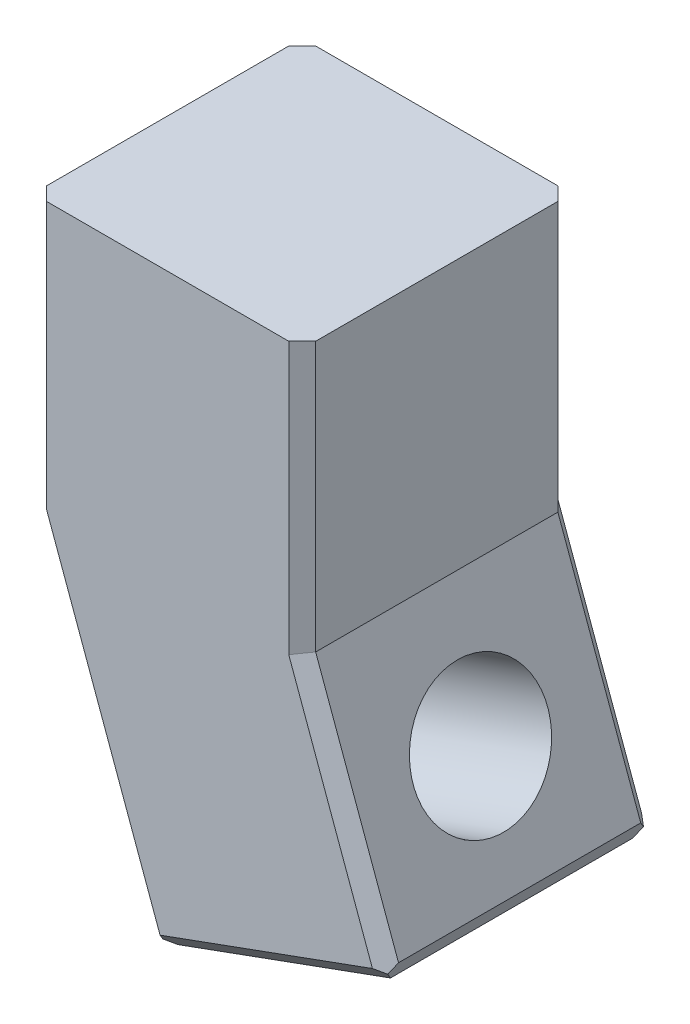
ISO-10303-21;
HEADER;
FILE_DESCRIPTION(('STEP AP214'),'2;1');
FILE_NAME('part.step','',(''),(''),'','','');
FILE_SCHEMA(('AUTOMOTIVE_DESIGN { 1 0 10303 214 1 1 1 1 }'));
ENDSEC;
DATA;
#1=APPLICATION_CONTEXT('core data for automotive mechanical design processes');
#2=APPLICATION_PROTOCOL_DEFINITION('international standard','automotive_design',2000,#1);
#3=PRODUCT_CONTEXT('',#1,'mechanical');
#4=PRODUCT('Part','Part','',(#3));
#5=PRODUCT_RELATED_PRODUCT_CATEGORY('part','',(#4));
#6=PRODUCT_DEFINITION_FORMATION('','',#4);
#7=PRODUCT_DEFINITION_CONTEXT('part definition',#1,'design');
#8=PRODUCT_DEFINITION('design','',#6,#7);
#9=PRODUCT_DEFINITION_SHAPE('','',#8);
#10=(LENGTH_UNIT() NAMED_UNIT(*) SI_UNIT(.MILLI.,.METRE.));
#11=(NAMED_UNIT(*) PLANE_ANGLE_UNIT() SI_UNIT($,.RADIAN.));
#12=(NAMED_UNIT(*) SI_UNIT($,.STERADIAN.) SOLID_ANGLE_UNIT());
#13=UNCERTAINTY_MEASURE_WITH_UNIT(LENGTH_MEASURE(1.E-05),#10,'distance_accuracy_value','');
#14=(GEOMETRIC_REPRESENTATION_CONTEXT(3) GLOBAL_UNCERTAINTY_ASSIGNED_CONTEXT((#13)) GLOBAL_UNIT_ASSIGNED_CONTEXT((#10,
#11,#12)) REPRESENTATION_CONTEXT('',''));
#15=CARTESIAN_POINT('',(0.,0.,0.));
#16=DIRECTION('',(0.,0.,1.));
#17=DIRECTION('',(1.,0.,0.));
#18=AXIS2_PLACEMENT_3D('',#15,#16,#17);
#19=CARTESIAN_POINT('',(10.,-10.,20.));
#20=DIRECTION('',(-1.,0.,0.));
#21=DIRECTION('',(0.,0.,1.));
#22=AXIS2_PLACEMENT_3D('',#19,#20,#21);
#23=PLANE('',#22);
#24=DIRECTION('',(0.,0.,-1.));
#25=VECTOR('',#24,1.);
#26=CARTESIAN_POINT('',(10.,-10.,20.));
#27=LINE('',#26,#25);
#28=CARTESIAN_POINT('',(10.,-10.,19.));
#29=VERTEX_POINT('',#28);
#30=CARTESIAN_POINT('',(10.,-10.,1.));
#31=VERTEX_POINT('',#30);
#32=EDGE_CURVE('E337',#29,#31,#27,.T.);
#33=ORIENTED_EDGE('',*,*,#32,.T.);
#34=DIRECTION('',(0.,1.,0.));
#35=VECTOR('',#34,1.);
#36=CARTESIAN_POINT('',(10.,10.,1.));
#37=LINE('',#36,#35);
#38=CARTESIAN_POINT('',(10.,10.,1.));
#39=VERTEX_POINT('',#38);
#40=EDGE_CURVE('E284',#31,#39,#37,.T.);
#41=ORIENTED_EDGE('',*,*,#40,.T.);
#42=DIRECTION('',(0.,0.,-1.));
#43=VECTOR('',#42,1.);
#44=CARTESIAN_POINT('',(10.,10.,20.));
#45=LINE('',#44,#43);
#46=CARTESIAN_POINT('',(10.,10.,19.));
#47=VERTEX_POINT('',#46);
#48=EDGE_CURVE('E183',#47,#39,#45,.T.);
#49=ORIENTED_EDGE('',*,*,#48,.F.);
#50=DIRECTION('',(0.,-1.,0.));
#51=VECTOR('',#50,1.);
#52=CARTESIAN_POINT('',(10.,-10.,19.));
#53=LINE('',#52,#51);
#54=EDGE_CURVE('E281',#47,#29,#53,.T.);
#55=ORIENTED_EDGE('',*,*,#54,.T.);
#56=EDGE_LOOP('',(#33,#41,#49,#55));
#57=FACE_BOUND('',#56,.T.);
#58=ADVANCED_FACE('F40',(#57),#23,.F.);
#59=CARTESIAN_POINT('',(-10.,10.,20.));
#60=DIRECTION('',(0.,-1.,0.));
#61=DIRECTION('',(0.,0.,-1.));
#62=AXIS2_PLACEMENT_3D('',#59,#60,#61);
#63=PLANE('',#62);
#64=DIRECTION('',(-1.,0.,0.));
#65=VECTOR('',#64,1.);
#66=CARTESIAN_POINT('',(-10.,10.,0.));
#67=LINE('',#66,#65);
#68=CARTESIAN_POINT('',(8.99999999999999,10.,0.));
#69=VERTEX_POINT('',#68);
#70=CARTESIAN_POINT('',(-9.,10.,0.));
#71=VERTEX_POINT('',#70);
#72=EDGE_CURVE('E357',#69,#71,#67,.T.);
#73=ORIENTED_EDGE('',*,*,#72,.T.);
#74=DIRECTION('',(-0.70710678118655,0.,0.707106781186545));
#75=VECTOR('',#74,1.);
#76=CARTESIAN_POINT('',(-10.,10.,1.));
#77=LINE('',#76,#75);
#78=CARTESIAN_POINT('',(-10.,10.,1.));
#79=VERTEX_POINT('',#78);
#80=EDGE_CURVE('E265',#71,#79,#77,.T.);
#81=ORIENTED_EDGE('',*,*,#80,.T.);
#82=DIRECTION('',(0.,0.,-1.));
#83=VECTOR('',#82,1.);
#84=CARTESIAN_POINT('',(-10.,10.,20.));
#85=LINE('',#84,#83);
#86=CARTESIAN_POINT('',(-10.,10.,19.));
#87=VERTEX_POINT('',#86);
#88=EDGE_CURVE('E322',#87,#79,#85,.T.);
#89=ORIENTED_EDGE('',*,*,#88,.F.);
#90=DIRECTION('',(-0.707106781186548,0.,-0.707106781186548));
#91=VECTOR('',#90,1.);
#92=CARTESIAN_POINT('',(-9.00000000000001,10.,20.));
#93=LINE('',#92,#91);
#94=CARTESIAN_POINT('',(-9.00000000000001,10.,20.));
#95=VERTEX_POINT('',#94);
#96=EDGE_CURVE('E256',#87,#95,#93,.F.);
#97=ORIENTED_EDGE('',*,*,#96,.T.);
#98=DIRECTION('',(-1.,0.,0.));
#99=VECTOR('',#98,1.);
#100=CARTESIAN_POINT('',(-10.,10.,20.));
#101=LINE('',#100,#99);
#102=CARTESIAN_POINT('',(9.,10.,20.));
#103=VERTEX_POINT('',#102);
#104=EDGE_CURVE('E352',#103,#95,#101,.T.);
#105=ORIENTED_EDGE('',*,*,#104,.F.);
#106=DIRECTION('',(-0.707106781186548,0.,0.707106781186548));
#107=VECTOR('',#106,1.);
#108=CARTESIAN_POINT('',(9.,10.,20.));
#109=LINE('',#108,#107);
#110=EDGE_CURVE('E259',#103,#47,#109,.F.);
#111=ORIENTED_EDGE('',*,*,#110,.T.);
#112=ORIENTED_EDGE('',*,*,#48,.T.);
#113=DIRECTION('',(-0.70710678118655,0.,-0.707106781186545));
#114=VECTOR('',#113,1.);
#115=CARTESIAN_POINT('',(10.,10.,1.));
#116=LINE('',#115,#114);
#117=EDGE_CURVE('E262',#39,#69,#116,.T.);
#118=ORIENTED_EDGE('',*,*,#117,.T.);
#119=EDGE_LOOP('',(#73,#81,#89,#97,#105,#111,#112,#118));
#120=FACE_BOUND('',#119,.T.);
#121=ADVANCED_FACE('F328',(#120),#63,.F.);
#122=CARTESIAN_POINT('',(-10.,-10.,20.));
#123=DIRECTION('',(1.,0.,0.));
#124=DIRECTION('',(0.,0.,-1.));
#125=AXIS2_PLACEMENT_3D('',#122,#123,#124);
#126=PLANE('',#125);
#127=ORIENTED_EDGE('',*,*,#88,.T.);
#128=DIRECTION('',(0.,-1.,0.));
#129=VECTOR('',#128,1.);
#130=CARTESIAN_POINT('',(-10.,-10.,1.));
#131=LINE('',#130,#129);
#132=CARTESIAN_POINT('',(-10.,-10.,1.));
#133=VERTEX_POINT('',#132);
#134=EDGE_CURVE('E253',#79,#133,#131,.T.);
#135=ORIENTED_EDGE('',*,*,#134,.T.);
#136=DIRECTION('',(0.,0.,-1.));
#137=VECTOR('',#136,1.);
#138=CARTESIAN_POINT('',(-10.,-10.,20.));
#139=LINE('',#138,#137);
#140=CARTESIAN_POINT('',(-10.,-10.,19.));
#141=VERTEX_POINT('',#140);
#142=EDGE_CURVE('E325',#141,#133,#139,.T.);
#143=ORIENTED_EDGE('',*,*,#142,.F.);
#144=DIRECTION('',(0.,1.,0.));
#145=VECTOR('',#144,1.);
#146=CARTESIAN_POINT('',(-10.,-10.,19.));
#147=LINE('',#146,#145);
#148=EDGE_CURVE('E250',#141,#87,#147,.T.);
#149=ORIENTED_EDGE('',*,*,#148,.T.);
#150=EDGE_LOOP('',(#127,#135,#143,#149));
#151=FACE_BOUND('',#150,.T.);
#152=ADVANCED_FACE('F321',(#151),#126,.F.);
#153=CARTESIAN_POINT('',(-10.,-10.,20.));
#154=DIRECTION('',(0.93969262078591,0.342020143325663,0.));
#155=DIRECTION('',(-0.342020143325663,0.939692620785911,0.));
#156=AXIS2_PLACEMENT_3D('',#153,#154,#155);
#157=PLANE('',#156);
#158=CARTESIAN_POINT('',(-4.41017693914646,-25.3579126384421,10.));
#159=DIRECTION('',(0.93969262078591,0.342020143325663,0.));
#160=DIRECTION('',(-0.342020143325663,0.939692620785911,0.));
#161=AXIS2_PLACEMENT_3D('',#158,#159,#160);
#162=CIRCLE('',#161,5.);
#163=CARTESIAN_POINT('',(-6.12027765577478,-20.6594495345126,10.));
#164=VERTEX_POINT('',#163);
#165=EDGE_CURVE('E370',#164,#164,#162,.T.);
#166=ORIENTED_EDGE('',*,*,#165,.T.);
#167=EDGE_LOOP('',(#166));
#168=FACE_BOUND('',#167,.T.);
#169=ORIENTED_EDGE('',*,*,#142,.T.);
#170=DIRECTION('',(0.342020143325663,-0.939692620785911,0.));
#171=VECTOR('',#170,1.);
#172=CARTESIAN_POINT('',(-1.50192959042872,-33.348256559233,1.));
#173=LINE('',#172,#171);
#174=CARTESIAN_POINT('',(-1.50192959042872,-33.348256559233,1.));
#175=VERTEX_POINT('',#174);
#176=EDGE_CURVE('E223',#133,#175,#173,.T.);
#177=ORIENTED_EDGE('',*,*,#176,.T.);
#178=DIRECTION('',(0.,0.,1.));
#179=VECTOR('',#178,1.);
#180=CARTESIAN_POINT('',(-1.50192959042872,-33.348256559233,20.));
#181=LINE('',#180,#179);
#182=CARTESIAN_POINT('',(-1.50192959042872,-33.348256559233,19.));
#183=VERTEX_POINT('',#182);
#184=EDGE_CURVE('E190',#175,#183,#181,.T.);
#185=ORIENTED_EDGE('',*,*,#184,.T.);
#186=DIRECTION('',(-0.342020143325663,0.939692620785911,0.));
#187=VECTOR('',#186,1.);
#188=CARTESIAN_POINT('',(-10.,-10.,19.));
#189=LINE('',#188,#187);
#190=EDGE_CURVE('E210',#183,#141,#189,.T.);
#191=ORIENTED_EDGE('',*,*,#190,.T.);
#192=EDGE_LOOP('',(#169,#177,#185,#191));
#193=FACE_BOUND('',#192,.T.);
#194=ADVANCED_FACE('F391',(#168,#193),#157,.F.);
#195=CARTESIAN_POINT('',(16.5005349840868,-27.8600730831536,20.));
#196=DIRECTION('',(-0.342020143325663,0.93969262078591,0.));
#197=DIRECTION('',(-0.93969262078591,-0.342020143325663,0.));
#198=AXIS2_PLACEMENT_3D('',#195,#196,#197);
#199=PLANE('',#198);
#200=DIRECTION('',(-0.93969262078591,-0.342020143325663,0.));
#201=VECTOR('',#200,1.);
#202=CARTESIAN_POINT('',(16.5005349840868,-27.8600730831536,19.));
#203=LINE('',#202,#201);
#204=CARTESIAN_POINT('',(15.5608423633009,-28.2020932264793,19.));
#205=VERTEX_POINT('',#204);
#206=CARTESIAN_POINT('',(-0.220216826317152,-33.9459290366933,19.));
#207=VERTEX_POINT('',#206);
#208=EDGE_CURVE('E187',#205,#207,#203,.T.);
#209=ORIENTED_EDGE('',*,*,#208,.T.);
#210=DIRECTION('',(0.,0.,-1.));
#211=VECTOR('',#210,1.);
#212=CARTESIAN_POINT('',(-0.220216826317156,-33.9459290366933,20.));
#213=LINE('',#212,#211);
#214=CARTESIAN_POINT('',(-0.220216826317152,-33.9459290366933,1.));
#215=VERTEX_POINT('',#214);
#216=EDGE_CURVE('E166',#207,#215,#213,.T.);
#217=ORIENTED_EDGE('',*,*,#216,.T.);
#218=DIRECTION('',(0.93969262078591,0.342020143325663,0.));
#219=VECTOR('',#218,1.);
#220=CARTESIAN_POINT('',(16.5005349840868,-27.8600730831536,1.));
#221=LINE('',#220,#219);
#222=CARTESIAN_POINT('',(15.5608423633009,-28.2020932264793,1.));
#223=VERTEX_POINT('',#222);
#224=EDGE_CURVE('E175',#215,#223,#221,.T.);
#225=ORIENTED_EDGE('',*,*,#224,.T.);
#226=DIRECTION('',(0.,0.,1.));
#227=VECTOR('',#226,1.);
#228=CARTESIAN_POINT('',(15.5608423633009,-28.2020932264793,20.));
#229=LINE('',#228,#227);
#230=EDGE_CURVE('E182',#223,#205,#229,.T.);
#231=ORIENTED_EDGE('',*,*,#230,.T.);
#232=EDGE_LOOP('',(#209,#217,#225,#231));
#233=FACE_BOUND('',#232,.T.);
#234=ADVANCED_FACE('F185',(#233),#199,.F.);
#235=CARTESIAN_POINT('',(10.,-10.,20.));
#236=DIRECTION('',(-0.93969262078591,-0.342020143325663,0.));
#237=DIRECTION('',(0.342020143325663,-0.93969262078591,0.));
#238=AXIS2_PLACEMENT_3D('',#235,#236,#237);
#239=PLANE('',#238);
#240=CARTESIAN_POINT('',(13.2502674920434,-18.9300365415768,10.));
#241=DIRECTION('',(0.93969262078591,0.342020143325663,0.));
#242=DIRECTION('',(-0.342020143325663,0.93969262078591,0.));
#243=AXIS2_PLACEMENT_3D('',#240,#241,#242);
#244=CIRCLE('',#243,5.);
#245=CARTESIAN_POINT('',(11.5401667754151,-14.2315734376473,10.));
#246=VERTEX_POINT('',#245);
#247=EDGE_CURVE('E220',#246,#246,#244,.T.);
#248=ORIENTED_EDGE('',*,*,#247,.F.);
#249=EDGE_LOOP('',(#248));
#250=FACE_BOUND('',#249,.T.);
#251=DIRECTION('',(0.,0.,-1.));
#252=VECTOR('',#251,1.);
#253=CARTESIAN_POINT('',(16.1585148407611,-26.9203804623677,20.));
#254=LINE('',#253,#252);
#255=CARTESIAN_POINT('',(16.1585148407611,-26.9203804623677,19.));
#256=VERTEX_POINT('',#255);
#257=CARTESIAN_POINT('',(16.1585148407611,-26.9203804623677,1.));
#258=VERTEX_POINT('',#257);
#259=EDGE_CURVE('E203',#256,#258,#254,.T.);
#260=ORIENTED_EDGE('',*,*,#259,.T.);
#261=DIRECTION('',(-0.342020143325663,0.93969262078591,0.));
#262=VECTOR('',#261,1.);
#263=CARTESIAN_POINT('',(10.,-10.,1.));
#264=LINE('',#263,#262);
#265=EDGE_CURVE('E271',#258,#31,#264,.T.);
#266=ORIENTED_EDGE('',*,*,#265,.T.);
#267=ORIENTED_EDGE('',*,*,#32,.F.);
#268=DIRECTION('',(0.342020143325663,-0.93969262078591,0.));
#269=VECTOR('',#268,1.);
#270=CARTESIAN_POINT('',(10.,-10.,19.));
#271=LINE('',#270,#269);
#272=EDGE_CURVE('E268',#29,#256,#271,.T.);
#273=ORIENTED_EDGE('',*,*,#272,.T.);
#274=EDGE_LOOP('',(#260,#266,#267,#273));
#275=FACE_BOUND('',#274,.T.);
#276=ADVANCED_FACE('F365',(#250,#275),#239,.F.);
#277=CARTESIAN_POINT('',(0.,0.,20.));
#278=DIRECTION('',(0.,0.,-1.));
#279=DIRECTION('',(-1.,0.,0.));
#280=AXIS2_PLACEMENT_3D('',#277,#278,#279);
#281=PLANE('',#280);
#282=DIRECTION('',(0.93969262078591,0.342020143325664,0.));
#283=VECTOR('',#282,1.);
#284=CARTESIAN_POINT('',(10.5422306735989,-28.9645407263953,20.));
#285=LINE('',#284,#283);
#286=CARTESIAN_POINT('',(-0.562236969642822,-33.0062364159074,20.));
#287=VERTEX_POINT('',#286);
#288=CARTESIAN_POINT('',(15.2188222199752,-27.2624006056934,20.));
#289=VERTEX_POINT('',#288);
#290=EDGE_CURVE('E195',#287,#289,#285,.T.);
#291=ORIENTED_EDGE('',*,*,#290,.T.);
#292=DIRECTION('',(-0.342020143325663,0.93969262078591,0.));
#293=VECTOR('',#292,1.);
#294=CARTESIAN_POINT('',(4.67659154637637,1.70214012070192,20.));
#295=LINE('',#294,#293);
#296=CARTESIAN_POINT('',(9.,-10.1763269807085,20.));
#297=VERTEX_POINT('',#296);
#298=EDGE_CURVE('E295',#289,#297,#295,.T.);
#299=ORIENTED_EDGE('',*,*,#298,.T.);
#300=DIRECTION('',(0.,1.,0.));
#301=VECTOR('',#300,1.);
#302=CARTESIAN_POINT('',(9.,0.,20.));
#303=LINE('',#302,#301);
#304=EDGE_CURVE('E292',#297,#103,#303,.T.);
#305=ORIENTED_EDGE('',*,*,#304,.T.);
#306=ORIENTED_EDGE('',*,*,#104,.T.);
#307=DIRECTION('',(0.,-1.,0.));
#308=VECTOR('',#307,1.);
#309=CARTESIAN_POINT('',(-9.00000000000001,0.,20.));
#310=LINE('',#309,#308);
#311=CARTESIAN_POINT('',(-9.00000000000001,-9.82367301929153,20.));
#312=VERTEX_POINT('',#311);
#313=EDGE_CURVE('E67',#95,#312,#310,.T.);
#314=ORIENTED_EDGE('',*,*,#313,.T.);
#315=DIRECTION('',(0.342020143325663,-0.939692620785911,0.));
#316=VECTOR('',#315,1.);
#317=CARTESIAN_POINT('',(-11.1044676432417,-4.04169568951206,20.));
#318=LINE('',#317,#316);
#319=EDGE_CURVE('E289',#312,#287,#318,.T.);
#320=ORIENTED_EDGE('',*,*,#319,.T.);
#321=EDGE_LOOP('',(#291,#299,#305,#306,#314,#320));
#322=FACE_BOUND('',#321,.T.);
#323=ADVANCED_FACE('F350',(#322),#281,.F.);
#324=CARTESIAN_POINT('',(0.,0.,0.));
#325=DIRECTION('',(0.,0.,-1.));
#326=DIRECTION('',(-1.,0.,0.));
#327=AXIS2_PLACEMENT_3D('',#324,#325,#326);
#328=PLANE('',#327);
#329=DIRECTION('',(-0.93969262078591,-0.342020143325664,0.));
#330=VECTOR('',#329,1.);
#331=CARTESIAN_POINT('',(-1.50192959042872,-33.348256559233,0.));
#332=LINE('',#331,#330);
#333=CARTESIAN_POINT('',(15.2188222199752,-27.2624006056934,0.));
#334=VERTEX_POINT('',#333);
#335=CARTESIAN_POINT('',(-0.562236969642803,-33.0062364159074,0.));
#336=VERTEX_POINT('',#335);
#337=EDGE_CURVE('E207',#334,#336,#332,.T.);
#338=ORIENTED_EDGE('',*,*,#337,.T.);
#339=DIRECTION('',(-0.342020143325663,0.939692620785911,0.));
#340=VECTOR('',#339,1.);
#341=CARTESIAN_POINT('',(-9.06030737921408,-9.65797985667433,0.));
#342=LINE('',#341,#340);
#343=CARTESIAN_POINT('',(-9.,-9.82367301929153,0.));
#344=VERTEX_POINT('',#343);
#345=EDGE_CURVE('E247',#336,#344,#342,.T.);
#346=ORIENTED_EDGE('',*,*,#345,.T.);
#347=DIRECTION('',(0.,1.,0.));
#348=VECTOR('',#347,1.);
#349=CARTESIAN_POINT('',(-9.,10.,0.));
#350=LINE('',#349,#348);
#351=EDGE_CURVE('E244',#344,#71,#350,.T.);
#352=ORIENTED_EDGE('',*,*,#351,.T.);
#353=ORIENTED_EDGE('',*,*,#72,.F.);
#354=DIRECTION('',(0.,-1.,0.));
#355=VECTOR('',#354,1.);
#356=CARTESIAN_POINT('',(8.99999999999999,-10.,0.));
#357=LINE('',#356,#355);
#358=CARTESIAN_POINT('',(8.99999999999999,-10.1763269807085,0.));
#359=VERTEX_POINT('',#358);
#360=EDGE_CURVE('E238',#69,#359,#357,.T.);
#361=ORIENTED_EDGE('',*,*,#360,.T.);
#362=DIRECTION('',(0.342020143325663,-0.93969262078591,0.));
#363=VECTOR('',#362,1.);
#364=CARTESIAN_POINT('',(15.2188222199752,-27.2624006056934,0.));
#365=LINE('',#364,#363);
#366=EDGE_CURVE('E241',#359,#334,#365,.T.);
#367=ORIENTED_EDGE('',*,*,#366,.T.);
#368=EDGE_LOOP('',(#338,#346,#352,#353,#361,#367));
#369=FACE_BOUND('',#368,.T.);
#370=ADVANCED_FACE('F388',(#369),#328,.T.);
#371=CARTESIAN_POINT('',(-5.54358492367481,-25.7704394080901,10.));
#372=DIRECTION('',(0.93969262078591,0.342020143325663,0.));
#373=DIRECTION('',(-0.342020143325663,0.93969262078591,0.));
#374=AXIS2_PLACEMENT_3D('',#371,#372,#373);
#375=CYLINDRICAL_SURFACE('',#374,5.);
#376=ORIENTED_EDGE('',*,*,#247,.T.);
#377=EDGE_LOOP('',(#376));
#378=FACE_BOUND('',#377,.T.);
#379=ORIENTED_EDGE('',*,*,#165,.F.);
#380=EDGE_LOOP('',(#379));
#381=FACE_BOUND('',#380,.T.);
#382=ADVANCED_FACE('F379',(#378,#381),#375,.F.);
#383=CARTESIAN_POINT('',(16.1585148407611,-26.9203804623677,20.));
#384=DIRECTION('',(-0.906307787036649,0.422618261740701,0.));
#385=DIRECTION('',(0.,0.,-1.));
#386=AXIS2_PLACEMENT_3D('',#383,#384,#385);
#387=PLANE('',#386);
#388=DIRECTION('',(0.345066365748901,0.739997209383598,-0.577350269189626));
#389=VECTOR('',#388,1.);
#390=CARTESIAN_POINT('',(15.7600665224543,-27.7748556384421,0.666666666666669));
#391=LINE('',#390,#389);
#392=CARTESIAN_POINT('',(15.859678602031,-27.5612368444235,0.5));
#393=VERTEX_POINT('',#392);
#394=EDGE_CURVE('E178',#393,#223,#391,.F.);
#395=ORIENTED_EDGE('',*,*,#394,.F.);
#396=DIRECTION('',(-0.345066365748902,-0.739997209383601,-0.577350269189622));
#397=VECTOR('',#396,1.);
#398=CARTESIAN_POINT('',(19.943773864676,-18.8028662896611,7.33333333333324));
#399=LINE('',#398,#397);
#400=EDGE_CURVE('E278',#393,#258,#399,.F.);
#401=ORIENTED_EDGE('',*,*,#400,.T.);
#402=ORIENTED_EDGE('',*,*,#259,.F.);
#403=DIRECTION('',(-0.345066365748901,-0.739997209383598,0.577350269189625));
#404=VECTOR('',#403,1.);
#405=CARTESIAN_POINT('',(15.9592906816077,-27.3476180504049,19.3333333333333));
#406=LINE('',#405,#404);
#407=CARTESIAN_POINT('',(15.859678602031,-27.5612368444235,19.5));
#408=VERTEX_POINT('',#407);
#409=EDGE_CURVE('E275',#256,#408,#406,.T.);
#410=ORIENTED_EDGE('',*,*,#409,.T.);
#411=DIRECTION('',(-0.345066365748901,-0.739997209383598,-0.577350269189626));
#412=VECTOR('',#411,1.);
#413=CARTESIAN_POINT('',(16.1585148407611,-26.9203804623677,20.));
#414=LINE('',#413,#412);
#415=EDGE_CURVE('E216',#205,#408,#414,.F.);
#416=ORIENTED_EDGE('',*,*,#415,.F.);
#417=ORIENTED_EDGE('',*,*,#230,.F.);
#418=EDGE_LOOP('',(#395,#401,#402,#410,#416,#417));
#419=FACE_BOUND('',#418,.T.);
#420=ADVANCED_FACE('F343',(#419),#387,.F.);
#421=CARTESIAN_POINT('',(10.5422306735989,-28.9645407263953,20.));
#422=DIRECTION('',(-0.241844762647971,0.664463024388675,-0.707106781186549));
#423=DIRECTION('',(0.93969262078591,0.342020143325663,0.));
#424=AXIS2_PLACEMENT_3D('',#421,#422,#423);
#425=PLANE('',#424);
#426=ORIENTED_EDGE('',*,*,#415,.T.);
#427=DIRECTION('',(-0.739997209383596,0.345066365748906,0.577350269189626));
#428=VECTOR('',#427,1.);
#429=CARTESIAN_POINT('',(13.0925783309491,-26.2709167971352,21.6589082582008));
#430=LINE('',#429,#428);
#431=EDGE_CURVE('E11',#408,#289,#430,.T.);
#432=ORIENTED_EDGE('',*,*,#431,.T.);
#433=ORIENTED_EDGE('',*,*,#290,.F.);
#434=DIRECTION('',(-0.345066365748904,-0.739997209383597,-0.577350269189625));
#435=VECTOR('',#434,1.);
#436=CARTESIAN_POINT('',(1.79202034826706,-27.9575153049894,23.9390425470386));
#437=LINE('',#436,#435);
#438=CARTESIAN_POINT('',(-0.861073208372939,-33.6470927979631,19.5));
#439=VERTEX_POINT('',#438);
#440=EDGE_CURVE('E51',#287,#439,#437,.T.);
#441=ORIENTED_EDGE('',*,*,#440,.T.);
#442=DIRECTION('',(0.739997209383595,-0.345066365748906,-0.577350269189626));
#443=VECTOR('',#442,1.);
#444=CARTESIAN_POINT('',(3.97402910852636,-35.9017380362963,15.7276241196281));
#445=LINE('',#444,#443);
#446=EDGE_CURVE('E171',#207,#439,#445,.F.);
#447=ORIENTED_EDGE('',*,*,#446,.F.);
#448=ORIENTED_EDGE('',*,*,#208,.F.);
#449=EDGE_LOOP('',(#426,#432,#433,#441,#447,#448));
#450=FACE_BOUND('',#449,.T.);
#451=ADVANCED_FACE('F348',(#450),#425,.F.);
#452=CARTESIAN_POINT('',(16.5005349840868,-27.8600730831536,1.));
#453=DIRECTION('',(0.241844762647971,-0.664463024388675,-0.707106781186549));
#454=DIRECTION('',(-0.93969262078591,-0.342020143325663,0.));
#455=AXIS2_PLACEMENT_3D('',#452,#453,#454);
#456=PLANE('',#455);
#457=DIRECTION('',(0.739997209383595,-0.345066365748906,0.577350269189626));
#458=VECTOR('',#457,1.);
#459=CARTESIAN_POINT('',(7.38198576166401,-37.4908943223147,6.93128413857272));
#460=LINE('',#459,#458);
#461=CARTESIAN_POINT('',(-0.861073208372934,-33.6470927979632,0.500000000000004));
#462=VERTEX_POINT('',#461);
#463=EDGE_CURVE('E160',#462,#215,#460,.T.);
#464=ORIENTED_EDGE('',*,*,#463,.F.);
#465=DIRECTION('',(0.345066365748907,0.739997209383597,-0.577350269189623));
#466=VECTOR('',#465,1.);
#467=CARTESIAN_POINT('',(2.58427999767185,-26.2585090040005,-5.26461747190608));
#468=LINE('',#467,#466);
#469=EDGE_CURVE('E235',#462,#336,#468,.T.);
#470=ORIENTED_EDGE('',*,*,#469,.T.);
#471=ORIENTED_EDGE('',*,*,#337,.F.);
#472=DIRECTION('',(0.739997209383598,-0.345066365748903,0.577350269189624));
#473=VECTOR('',#472,1.);
#474=CARTESIAN_POINT('',(16.5005349840868,-27.8600730831536,1.));
#475=LINE('',#474,#473);
#476=EDGE_CURVE('E232',#334,#393,#475,.T.);
#477=ORIENTED_EDGE('',*,*,#476,.T.);
#478=ORIENTED_EDGE('',*,*,#394,.T.);
#479=ORIENTED_EDGE('',*,*,#224,.F.);
#480=EDGE_LOOP('',(#464,#470,#471,#477,#478,#479));
#481=FACE_BOUND('',#480,.T.);
#482=ADVANCED_FACE('F176',(#481),#456,.T.);
#483=CARTESIAN_POINT('',(-0.220216826317149,-33.9459290366933,20.));
#484=DIRECTION('',(0.422618261740707,0.906307787036646,0.));
#485=DIRECTION('',(0.,0.,-1.));
#486=AXIS2_PLACEMENT_3D('',#483,#484,#485);
#487=PLANE('',#486);
#488=ORIENTED_EDGE('',*,*,#184,.F.);
#489=DIRECTION('',(-0.739997209383598,0.345066365748908,0.577350269189621));
#490=VECTOR('',#489,1.);
#491=CARTESIAN_POINT('',(-8.76496858706092,-29.961445853625,6.66666666666657));
#492=LINE('',#491,#490);
#493=EDGE_CURVE('E167',#175,#462,#492,.F.);
#494=ORIENTED_EDGE('',*,*,#493,.T.);
#495=ORIENTED_EDGE('',*,*,#463,.T.);
#496=ORIENTED_EDGE('',*,*,#216,.F.);
#497=ORIENTED_EDGE('',*,*,#446,.T.);
#498=DIRECTION('',(-0.739997209383596,0.345066365748907,-0.577350269189624));
#499=VECTOR('',#498,1.);
#500=CARTESIAN_POINT('',(-0.220216826317149,-33.9459290366933,20.));
#501=LINE('',#500,#499);
#502=EDGE_CURVE('E227',#439,#183,#501,.T.);
#503=ORIENTED_EDGE('',*,*,#502,.T.);
#504=EDGE_LOOP('',(#488,#494,#495,#496,#497,#503));
#505=FACE_BOUND('',#504,.T.);
#506=ADVANCED_FACE('F163',(#505),#487,.F.);
#507=CARTESIAN_POINT('',(-10.,-10.,1.));
#508=DIRECTION('',(-0.707106781186545,0.,-0.70710678118655));
#509=DIRECTION('',(0.,1.,0.));
#510=AXIS2_PLACEMENT_3D('',#507,#508,#509);
#511=PLANE('',#510);
#512=ORIENTED_EDGE('',*,*,#80,.F.);
#513=ORIENTED_EDGE('',*,*,#351,.F.);
#514=DIRECTION('',(-0.701673843159865,-0.123724030206487,0.701673843159861));
#515=VECTOR('',#514,1.);
#516=CARTESIAN_POINT('',(-10.,-10.,1.));
#517=LINE('',#516,#515);
#518=EDGE_CURVE('E172',#133,#344,#517,.F.);
#519=ORIENTED_EDGE('',*,*,#518,.F.);
#520=ORIENTED_EDGE('',*,*,#134,.F.);
#521=EDGE_LOOP('',(#512,#513,#519,#520));
#522=FACE_BOUND('',#521,.T.);
#523=ADVANCED_FACE('F410',(#522),#511,.T.);
#524=CARTESIAN_POINT('',(-10.,-10.,1.));
#525=DIRECTION('',(-0.664463024388673,-0.24184476264797,-0.707106781186551));
#526=DIRECTION('',(-0.342020143325663,0.939692620785911,0.));
#527=AXIS2_PLACEMENT_3D('',#524,#525,#526);
#528=PLANE('',#527);
#529=ORIENTED_EDGE('',*,*,#518,.T.);
#530=ORIENTED_EDGE('',*,*,#345,.F.);
#531=ORIENTED_EDGE('',*,*,#469,.F.);
#532=ORIENTED_EDGE('',*,*,#493,.F.);
#533=ORIENTED_EDGE('',*,*,#176,.F.);
#534=EDGE_LOOP('',(#529,#530,#531,#532,#533));
#535=FACE_BOUND('',#534,.T.);
#536=ADVANCED_FACE('F426',(#535),#528,.T.);
#537=CARTESIAN_POINT('',(10.,-10.,1.));
#538=DIRECTION('',(0.707106781186545,0.,-0.70710678118655));
#539=DIRECTION('',(0.,-1.,0.));
#540=AXIS2_PLACEMENT_3D('',#537,#538,#539);
#541=PLANE('',#540);
#542=ORIENTED_EDGE('',*,*,#117,.F.);
#543=ORIENTED_EDGE('',*,*,#40,.F.);
#544=DIRECTION('',(-0.701673843159866,-0.123724030206482,-0.701673843159861));
#545=VECTOR('',#544,1.);
#546=CARTESIAN_POINT('',(10.,-10.,1.));
#547=LINE('',#546,#545);
#548=EDGE_CURVE('E304',#359,#31,#547,.F.);
#549=ORIENTED_EDGE('',*,*,#548,.F.);
#550=ORIENTED_EDGE('',*,*,#360,.F.);
#551=EDGE_LOOP('',(#542,#543,#549,#550));
#552=FACE_BOUND('',#551,.T.);
#553=ADVANCED_FACE('F432',(#552),#541,.T.);
#554=CARTESIAN_POINT('',(10.,-10.,1.));
#555=DIRECTION('',(0.664463024388674,0.24184476264797,-0.70710678118655));
#556=DIRECTION('',(0.342020143325663,-0.93969262078591,0.));
#557=AXIS2_PLACEMENT_3D('',#554,#555,#556);
#558=PLANE('',#557);
#559=ORIENTED_EDGE('',*,*,#476,.F.);
#560=ORIENTED_EDGE('',*,*,#366,.F.);
#561=ORIENTED_EDGE('',*,*,#548,.T.);
#562=ORIENTED_EDGE('',*,*,#265,.F.);
#563=ORIENTED_EDGE('',*,*,#400,.F.);
#564=EDGE_LOOP('',(#559,#560,#561,#562,#563));
#565=FACE_BOUND('',#564,.T.);
#566=ADVANCED_FACE('F440',(#565),#558,.T.);
#567=CARTESIAN_POINT('',(9.,0.,20.));
#568=DIRECTION('',(-0.707106781186547,0.,-0.707106781186547));
#569=DIRECTION('',(0.,1.,0.));
#570=AXIS2_PLACEMENT_3D('',#567,#568,#569);
#571=PLANE('',#570);
#572=ORIENTED_EDGE('',*,*,#110,.F.);
#573=ORIENTED_EDGE('',*,*,#304,.F.);
#574=DIRECTION('',(0.701673843159864,0.123724030206478,-0.701673843159864));
#575=VECTOR('',#574,1.);
#576=CARTESIAN_POINT('',(7.90260259624993,-10.369827751549,21.0973974037501));
#577=LINE('',#576,#575);
#578=EDGE_CURVE('E59',#29,#297,#577,.F.);
#579=ORIENTED_EDGE('',*,*,#578,.F.);
#580=ORIENTED_EDGE('',*,*,#54,.F.);
#581=EDGE_LOOP('',(#572,#573,#579,#580));
#582=FACE_BOUND('',#581,.T.);
#583=ADVANCED_FACE('F360',(#582),#571,.F.);
#584=CARTESIAN_POINT('',(4.67659154637637,1.70214012070192,20.));
#585=DIRECTION('',(-0.664463024388677,-0.241844762647972,-0.707106781186547));
#586=DIRECTION('',(-0.342020143325663,0.93969262078591,0.));
#587=AXIS2_PLACEMENT_3D('',#584,#585,#586);
#588=PLANE('',#587);
#589=ORIENTED_EDGE('',*,*,#409,.F.);
#590=ORIENTED_EDGE('',*,*,#272,.F.);
#591=ORIENTED_EDGE('',*,*,#578,.T.);
#592=ORIENTED_EDGE('',*,*,#298,.F.);
#593=ORIENTED_EDGE('',*,*,#431,.F.);
#594=EDGE_LOOP('',(#589,#590,#591,#592,#593));
#595=FACE_BOUND('',#594,.T.);
#596=ADVANCED_FACE('F351',(#595),#588,.F.);
#597=CARTESIAN_POINT('',(-9.00000000000001,0.,20.));
#598=DIRECTION('',(0.707106781186547,0.,-0.707106781186547));
#599=DIRECTION('',(0.,-1.,0.));
#600=AXIS2_PLACEMENT_3D('',#597,#598,#599);
#601=PLANE('',#600);
#602=ORIENTED_EDGE('',*,*,#96,.F.);
#603=ORIENTED_EDGE('',*,*,#148,.F.);
#604=DIRECTION('',(0.701673843159863,0.123724030206485,0.701673843159863));
#605=VECTOR('',#604,1.);
#606=CARTESIAN_POINT('',(-8.14716847798843,-9.67329581196222,20.8528315220116));
#607=LINE('',#606,#605);
#608=EDGE_CURVE('E45',#312,#141,#607,.F.);
#609=ORIENTED_EDGE('',*,*,#608,.F.);
#610=ORIENTED_EDGE('',*,*,#313,.F.);
#611=EDGE_LOOP('',(#602,#603,#609,#610));
#612=FACE_BOUND('',#611,.T.);
#613=ADVANCED_FACE('F43',(#612),#601,.F.);
#614=CARTESIAN_POINT('',(-11.1044676432417,-4.04169568951206,20.));
#615=DIRECTION('',(0.664463024388675,0.241844762647971,-0.707106781186548));
#616=DIRECTION('',(0.342020143325663,-0.939692620785911,0.));
#617=AXIS2_PLACEMENT_3D('',#614,#615,#616);
#618=PLANE('',#617);
#619=ORIENTED_EDGE('',*,*,#608,.T.);
#620=ORIENTED_EDGE('',*,*,#190,.F.);
#621=ORIENTED_EDGE('',*,*,#502,.F.);
#622=ORIENTED_EDGE('',*,*,#440,.F.);
#623=ORIENTED_EDGE('',*,*,#319,.F.);
#624=EDGE_LOOP('',(#619,#620,#621,#622,#623));
#625=FACE_BOUND('',#624,.T.);
#626=ADVANCED_FACE('F312',(#625),#618,.F.);
#627=CLOSED_SHELL('',(#58,#121,#152,#194,#234,#276,#323,#370,#382,#420,#451,#482,#506,#523,#536,
#553,#566,#583,#596,#613,#626));
#628=MANIFOLD_SOLID_BREP('B2',#627);
#629=ADVANCED_BREP_SHAPE_REPRESENTATION('',(#18,#628),#14);
#630=SHAPE_DEFINITION_REPRESENTATION(#9,#629);
ENDSEC;
END-ISO-10303-21;
